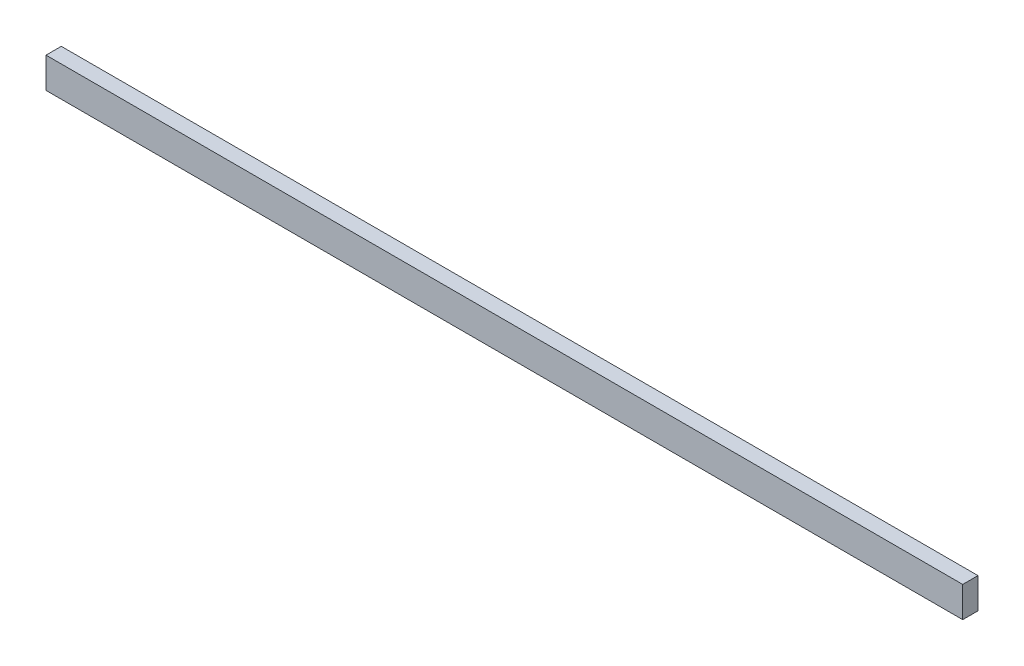
ISO-10303-21;
HEADER;
FILE_DESCRIPTION(('STEP AP214'),'2;1');
FILE_NAME('part.step','',(''),(''),'','','');
FILE_SCHEMA(('AUTOMOTIVE_DESIGN { 1 0 10303 214 1 1 1 1 }'));
ENDSEC;
DATA;
#1=APPLICATION_CONTEXT('core data for automotive mechanical design processes');
#2=APPLICATION_PROTOCOL_DEFINITION('international standard','automotive_design',2000,#1);
#3=PRODUCT_CONTEXT('',#1,'mechanical');
#4=PRODUCT('Part','Part','',(#3));
#5=PRODUCT_RELATED_PRODUCT_CATEGORY('part','',(#4));
#6=PRODUCT_DEFINITION_FORMATION('','',#4);
#7=PRODUCT_DEFINITION_CONTEXT('part definition',#1,'design');
#8=PRODUCT_DEFINITION('design','',#6,#7);
#9=PRODUCT_DEFINITION_SHAPE('','',#8);
#10=(LENGTH_UNIT() NAMED_UNIT(*) SI_UNIT(.MILLI.,.METRE.));
#11=(NAMED_UNIT(*) PLANE_ANGLE_UNIT() SI_UNIT($,.RADIAN.));
#12=(NAMED_UNIT(*) SI_UNIT($,.STERADIAN.) SOLID_ANGLE_UNIT());
#13=UNCERTAINTY_MEASURE_WITH_UNIT(LENGTH_MEASURE(1.E-05),#10,'distance_accuracy_value','');
#14=(GEOMETRIC_REPRESENTATION_CONTEXT(3) GLOBAL_UNCERTAINTY_ASSIGNED_CONTEXT((#13)) GLOBAL_UNIT_ASSIGNED_CONTEXT((#10,
#11,#12)) REPRESENTATION_CONTEXT('',''));
#15=CARTESIAN_POINT('',(0.,0.,0.));
#16=DIRECTION('',(0.,0.,1.));
#17=DIRECTION('',(1.,0.,0.));
#18=AXIS2_PLACEMENT_3D('',#15,#16,#17);
#19=CARTESIAN_POINT('',(0.,0.,2.54));
#20=DIRECTION('',(1.,0.,0.));
#21=DIRECTION('',(0.,0.,-1.));
#22=AXIS2_PLACEMENT_3D('',#19,#20,#21);
#23=PLANE('',#22);
#24=DIRECTION('',(0.,-1.,0.));
#25=VECTOR('',#24,1.);
#26=CARTESIAN_POINT('',(0.,0.,0.));
#27=LINE('',#26,#25);
#28=CARTESIAN_POINT('',(0.,5.08,0.));
#29=VERTEX_POINT('',#28);
#30=CARTESIAN_POINT('',(0.,0.,0.));
#31=VERTEX_POINT('',#30);
#32=EDGE_CURVE('E103',#29,#31,#27,.T.);
#33=ORIENTED_EDGE('',*,*,#32,.T.);
#34=DIRECTION('',(0.,0.,-1.));
#35=VECTOR('',#34,1.);
#36=CARTESIAN_POINT('',(0.,0.,2.54));
#37=LINE('',#36,#35);
#38=CARTESIAN_POINT('',(0.,0.,2.54));
#39=VERTEX_POINT('',#38);
#40=EDGE_CURVE('E11',#39,#31,#37,.T.);
#41=ORIENTED_EDGE('',*,*,#40,.F.);
#42=DIRECTION('',(0.,-1.,0.));
#43=VECTOR('',#42,1.);
#44=CARTESIAN_POINT('',(0.,0.,2.54));
#45=LINE('',#44,#43);
#46=CARTESIAN_POINT('',(0.,5.08,2.54));
#47=VERTEX_POINT('',#46);
#48=EDGE_CURVE('E91',#47,#39,#45,.T.);
#49=ORIENTED_EDGE('',*,*,#48,.F.);
#50=DIRECTION('',(0.,0.,-1.));
#51=VECTOR('',#50,1.);
#52=CARTESIAN_POINT('',(0.,5.08,2.54));
#53=LINE('',#52,#51);
#54=EDGE_CURVE('E99',#47,#29,#53,.T.);
#55=ORIENTED_EDGE('',*,*,#54,.T.);
#56=EDGE_LOOP('',(#33,#41,#49,#55));
#57=FACE_BOUND('',#56,.T.);
#58=ADVANCED_FACE('F40',(#57),#23,.F.);
#59=CARTESIAN_POINT('',(0.,0.,2.54));
#60=DIRECTION('',(0.,1.,0.));
#61=DIRECTION('',(0.,0.,1.));
#62=AXIS2_PLACEMENT_3D('',#59,#60,#61);
#63=PLANE('',#62);
#64=DIRECTION('',(1.,0.,0.));
#65=VECTOR('',#64,1.);
#66=CARTESIAN_POINT('',(0.,0.,0.));
#67=LINE('',#66,#65);
#68=CARTESIAN_POINT('',(152.4,0.,0.));
#69=VERTEX_POINT('',#68);
#70=EDGE_CURVE('E95',#31,#69,#67,.T.);
#71=ORIENTED_EDGE('',*,*,#70,.T.);
#72=DIRECTION('',(0.,0.,-1.));
#73=VECTOR('',#72,1.);
#74=CARTESIAN_POINT('',(152.4,0.,2.54));
#75=LINE('',#74,#73);
#76=CARTESIAN_POINT('',(152.4,0.,2.54));
#77=VERTEX_POINT('',#76);
#78=EDGE_CURVE('E48',#77,#69,#75,.T.);
#79=ORIENTED_EDGE('',*,*,#78,.F.);
#80=DIRECTION('',(1.,0.,0.));
#81=VECTOR('',#80,1.);
#82=CARTESIAN_POINT('',(0.,0.,2.54));
#83=LINE('',#82,#81);
#84=EDGE_CURVE('E86',#39,#77,#83,.T.);
#85=ORIENTED_EDGE('',*,*,#84,.F.);
#86=ORIENTED_EDGE('',*,*,#40,.T.);
#87=EDGE_LOOP('',(#71,#79,#85,#86));
#88=FACE_BOUND('',#87,.T.);
#89=ADVANCED_FACE('F94',(#88),#63,.F.);
#90=CARTESIAN_POINT('',(152.4,0.,2.54));
#91=DIRECTION('',(-1.,0.,0.));
#92=DIRECTION('',(0.,0.,1.));
#93=AXIS2_PLACEMENT_3D('',#90,#91,#92);
#94=PLANE('',#93);
#95=DIRECTION('',(0.,1.,0.));
#96=VECTOR('',#95,1.);
#97=CARTESIAN_POINT('',(152.4,0.,0.));
#98=LINE('',#97,#96);
#99=CARTESIAN_POINT('',(152.4,5.08,0.));
#100=VERTEX_POINT('',#99);
#101=EDGE_CURVE('E73',#69,#100,#98,.T.);
#102=ORIENTED_EDGE('',*,*,#101,.T.);
#103=DIRECTION('',(0.,0.,-1.));
#104=VECTOR('',#103,1.);
#105=CARTESIAN_POINT('',(152.4,5.08,2.54));
#106=LINE('',#105,#104);
#107=CARTESIAN_POINT('',(152.4,5.08,2.54));
#108=VERTEX_POINT('',#107);
#109=EDGE_CURVE('E96',#108,#100,#106,.T.);
#110=ORIENTED_EDGE('',*,*,#109,.F.);
#111=DIRECTION('',(0.,1.,0.));
#112=VECTOR('',#111,1.);
#113=CARTESIAN_POINT('',(152.4,0.,2.54));
#114=LINE('',#113,#112);
#115=EDGE_CURVE('E89',#77,#108,#114,.T.);
#116=ORIENTED_EDGE('',*,*,#115,.F.);
#117=ORIENTED_EDGE('',*,*,#78,.T.);
#118=EDGE_LOOP('',(#102,#110,#116,#117));
#119=FACE_BOUND('',#118,.T.);
#120=ADVANCED_FACE('F97',(#119),#94,.F.);
#121=CARTESIAN_POINT('',(0.,5.08,2.54));
#122=DIRECTION('',(0.,-1.,0.));
#123=DIRECTION('',(0.,0.,-1.));
#124=AXIS2_PLACEMENT_3D('',#121,#122,#123);
#125=PLANE('',#124);
#126=DIRECTION('',(-1.,0.,0.));
#127=VECTOR('',#126,1.);
#128=CARTESIAN_POINT('',(0.,5.08,0.));
#129=LINE('',#128,#127);
#130=EDGE_CURVE('E79',#100,#29,#129,.T.);
#131=ORIENTED_EDGE('',*,*,#130,.T.);
#132=ORIENTED_EDGE('',*,*,#54,.F.);
#133=DIRECTION('',(-1.,0.,0.));
#134=VECTOR('',#133,1.);
#135=CARTESIAN_POINT('',(0.,5.08,2.54));
#136=LINE('',#135,#134);
#137=EDGE_CURVE('E56',#108,#47,#136,.T.);
#138=ORIENTED_EDGE('',*,*,#137,.F.);
#139=ORIENTED_EDGE('',*,*,#109,.T.);
#140=EDGE_LOOP('',(#131,#132,#138,#139));
#141=FACE_BOUND('',#140,.T.);
#142=ADVANCED_FACE('F110',(#141),#125,.F.);
#143=CARTESIAN_POINT('',(0.,5.08,2.54));
#144=DIRECTION('',(0.,0.,-1.));
#145=DIRECTION('',(-1.,0.,0.));
#146=AXIS2_PLACEMENT_3D('',#143,#144,#145);
#147=PLANE('',#146);
#148=ORIENTED_EDGE('',*,*,#48,.T.);
#149=ORIENTED_EDGE('',*,*,#84,.T.);
#150=ORIENTED_EDGE('',*,*,#115,.T.);
#151=ORIENTED_EDGE('',*,*,#137,.T.);
#152=EDGE_LOOP('',(#148,#149,#150,#151));
#153=FACE_BOUND('',#152,.T.);
#154=ADVANCED_FACE('F87',(#153),#147,.F.);
#155=CARTESIAN_POINT('',(0.,5.08,0.));
#156=DIRECTION('',(0.,0.,-1.));
#157=DIRECTION('',(-1.,0.,0.));
#158=AXIS2_PLACEMENT_3D('',#155,#156,#157);
#159=PLANE('',#158);
#160=ORIENTED_EDGE('',*,*,#32,.F.);
#161=ORIENTED_EDGE('',*,*,#130,.F.);
#162=ORIENTED_EDGE('',*,*,#101,.F.);
#163=ORIENTED_EDGE('',*,*,#70,.F.);
#164=EDGE_LOOP('',(#160,#161,#162,#163));
#165=FACE_BOUND('',#164,.T.);
#166=ADVANCED_FACE('F113',(#165),#159,.T.);
#167=CLOSED_SHELL('',(#58,#89,#120,#142,#154,#166));
#168=MANIFOLD_SOLID_BREP('B2',#167);
#169=ADVANCED_BREP_SHAPE_REPRESENTATION('',(#18,#168),#14);
#170=SHAPE_DEFINITION_REPRESENTATION(#9,#169);
ENDSEC;
END-ISO-10303-21;
